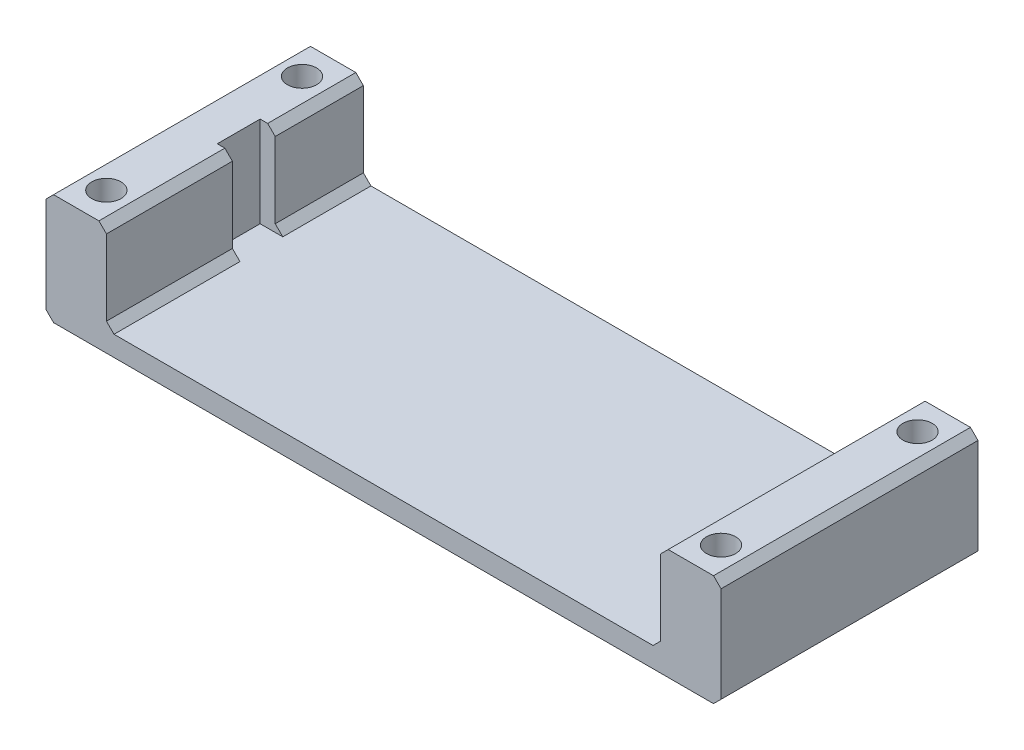
ISO-10303-21;
HEADER;
FILE_DESCRIPTION(('STEP AP214'),'2;1');
FILE_NAME('part.step','',(''),(''),'','','');
FILE_SCHEMA(('AUTOMOTIVE_DESIGN { 1 0 10303 214 1 1 1 1 }'));
ENDSEC;
DATA;
#1=APPLICATION_CONTEXT('core data for automotive mechanical design processes');
#2=APPLICATION_PROTOCOL_DEFINITION('international standard','automotive_design',2000,#1);
#3=PRODUCT_CONTEXT('',#1,'mechanical');
#4=PRODUCT('Part','Part','',(#3));
#5=PRODUCT_RELATED_PRODUCT_CATEGORY('part','',(#4));
#6=PRODUCT_DEFINITION_FORMATION('','',#4);
#7=PRODUCT_DEFINITION_CONTEXT('part definition',#1,'design');
#8=PRODUCT_DEFINITION('design','',#6,#7);
#9=PRODUCT_DEFINITION_SHAPE('','',#8);
#10=(LENGTH_UNIT() NAMED_UNIT(*) SI_UNIT(.MILLI.,.METRE.));
#11=(NAMED_UNIT(*) PLANE_ANGLE_UNIT() SI_UNIT($,.RADIAN.));
#12=(NAMED_UNIT(*) SI_UNIT($,.STERADIAN.) SOLID_ANGLE_UNIT());
#13=UNCERTAINTY_MEASURE_WITH_UNIT(LENGTH_MEASURE(1.E-05),#10,'distance_accuracy_value','');
#14=(GEOMETRIC_REPRESENTATION_CONTEXT(3) GLOBAL_UNCERTAINTY_ASSIGNED_CONTEXT((#13)) GLOBAL_UNIT_ASSIGNED_CONTEXT((#10,
#11,#12)) REPRESENTATION_CONTEXT('',''));
#15=CARTESIAN_POINT('',(0.,0.,0.));
#16=DIRECTION('',(0.,0.,1.));
#17=DIRECTION('',(1.,0.,0.));
#18=AXIS2_PLACEMENT_3D('',#15,#16,#17);
#19=CARTESIAN_POINT('',(0.,2.,0.));
#20=DIRECTION('',(0.,-1.,0.));
#21=DIRECTION('',(0.,0.,-1.));
#22=AXIS2_PLACEMENT_3D('',#19,#20,#21);
#23=PLANE('',#22);
#24=DIRECTION('',(-1.,0.,0.));
#25=VECTOR('',#24,1.);
#26=CARTESIAN_POINT('',(0.,2.,-25.5));
#27=LINE('',#26,#25);
#28=CARTESIAN_POINT('',(60.25,2.,-25.5));
#29=VERTEX_POINT('',#28);
#30=CARTESIAN_POINT('',(6.74999999999999,2.,-25.5));
#31=VERTEX_POINT('',#30);
#32=EDGE_CURVE('E284',#29,#31,#27,.T.);
#33=ORIENTED_EDGE('',*,*,#32,.T.);
#34=DIRECTION('',(0.,0.,1.));
#35=VECTOR('',#34,1.);
#36=CARTESIAN_POINT('',(6.74999999999999,2.,-16.75));
#37=LINE('',#36,#35);
#38=CARTESIAN_POINT('',(6.74999999999999,2.,-16.75));
#39=VERTEX_POINT('',#38);
#40=EDGE_CURVE('E324',#31,#39,#37,.T.);
#41=ORIENTED_EDGE('',*,*,#40,.T.);
#42=DIRECTION('',(1.,0.,0.));
#43=VECTOR('',#42,1.);
#44=CARTESIAN_POINT('',(6.,2.,-16.75));
#45=LINE('',#44,#43);
#46=CARTESIAN_POINT('',(4.5,2.,-16.75));
#47=VERTEX_POINT('',#46);
#48=EDGE_CURVE('E243',#47,#39,#45,.T.);
#49=ORIENTED_EDGE('',*,*,#48,.F.);
#50=DIRECTION('',(0.,0.,-1.));
#51=VECTOR('',#50,1.);
#52=CARTESIAN_POINT('',(4.5,2.,-16.75));
#53=LINE('',#52,#51);
#54=CARTESIAN_POINT('',(4.5,2.,-12.5));
#55=VERTEX_POINT('',#54);
#56=EDGE_CURVE('E237',#55,#47,#53,.T.);
#57=ORIENTED_EDGE('',*,*,#56,.F.);
#58=DIRECTION('',(-1.,0.,0.));
#59=VECTOR('',#58,1.);
#60=CARTESIAN_POINT('',(6.,2.,-12.5));
#61=LINE('',#60,#59);
#62=CARTESIAN_POINT('',(6.74999999999999,2.,-12.5));
#63=VERTEX_POINT('',#62);
#64=EDGE_CURVE('E220',#63,#55,#61,.T.);
#65=ORIENTED_EDGE('',*,*,#64,.F.);
#66=DIRECTION('',(0.,0.,1.));
#67=VECTOR('',#66,1.);
#68=CARTESIAN_POINT('',(6.74999999999999,2.,0.));
#69=LINE('',#68,#67);
#70=CARTESIAN_POINT('',(6.74999999999999,2.,0.));
#71=VERTEX_POINT('',#70);
#72=EDGE_CURVE('E318',#63,#71,#69,.T.);
#73=ORIENTED_EDGE('',*,*,#72,.T.);
#74=DIRECTION('',(1.,0.,0.));
#75=VECTOR('',#74,1.);
#76=CARTESIAN_POINT('',(0.,2.,0.));
#77=LINE('',#76,#75);
#78=CARTESIAN_POINT('',(60.25,2.,0.));
#79=VERTEX_POINT('',#78);
#80=EDGE_CURVE('E276',#71,#79,#77,.T.);
#81=ORIENTED_EDGE('',*,*,#80,.T.);
#82=DIRECTION('',(0.,0.,-1.));
#83=VECTOR('',#82,1.);
#84=CARTESIAN_POINT('',(60.25,2.,-25.5));
#85=LINE('',#84,#83);
#86=EDGE_CURVE('E320',#79,#29,#85,.T.);
#87=ORIENTED_EDGE('',*,*,#86,.T.);
#88=EDGE_LOOP('',(#33,#41,#49,#57,#65,#73,#81,#87));
#89=FACE_BOUND('',#88,.T.);
#90=ADVANCED_FACE('F50',(#89),#23,.F.);
#91=CARTESIAN_POINT('',(0.,2.,0.));
#92=DIRECTION('',(1.,0.,0.));
#93=DIRECTION('',(0.,0.,-1.));
#94=AXIS2_PLACEMENT_3D('',#91,#92,#93);
#95=PLANE('',#94);
#96=DIRECTION('',(0.,-1.,0.));
#97=VECTOR('',#96,1.);
#98=CARTESIAN_POINT('',(0.,2.,0.));
#99=LINE('',#98,#97);
#100=CARTESIAN_POINT('',(0.,10.25,0.));
#101=VERTEX_POINT('',#100);
#102=CARTESIAN_POINT('',(0.,0.749999999999994,0.));
#103=VERTEX_POINT('',#102);
#104=EDGE_CURVE('E306',#101,#103,#99,.T.);
#105=ORIENTED_EDGE('',*,*,#104,.F.);
#106=DIRECTION('',(0.,0.,-1.));
#107=VECTOR('',#106,1.);
#108=CARTESIAN_POINT('',(0.,10.25,0.));
#109=LINE('',#108,#107);
#110=CARTESIAN_POINT('',(0.,10.25,-25.5));
#111=VERTEX_POINT('',#110);
#112=EDGE_CURVE('E407',#101,#111,#109,.T.);
#113=ORIENTED_EDGE('',*,*,#112,.T.);
#114=DIRECTION('',(0.,-1.,0.));
#115=VECTOR('',#114,1.);
#116=CARTESIAN_POINT('',(0.,2.,-25.5));
#117=LINE('',#116,#115);
#118=CARTESIAN_POINT('',(0.,0.749999999999994,-25.5));
#119=VERTEX_POINT('',#118);
#120=EDGE_CURVE('E289',#111,#119,#117,.T.);
#121=ORIENTED_EDGE('',*,*,#120,.T.);
#122=DIRECTION('',(0.,0.,1.));
#123=VECTOR('',#122,1.);
#124=CARTESIAN_POINT('',(0.,0.749999999999994,0.));
#125=LINE('',#124,#123);
#126=EDGE_CURVE('E405',#119,#103,#125,.T.);
#127=ORIENTED_EDGE('',*,*,#126,.T.);
#128=EDGE_LOOP('',(#105,#113,#121,#127));
#129=FACE_BOUND('',#128,.T.);
#130=ADVANCED_FACE('F483',(#129),#95,.F.);
#131=CARTESIAN_POINT('',(0.,2.,0.));
#132=DIRECTION('',(0.,0.,-1.));
#133=DIRECTION('',(-1.,0.,0.));
#134=AXIS2_PLACEMENT_3D('',#131,#132,#133);
#135=PLANE('',#134);
#136=DIRECTION('',(0.,-1.,0.));
#137=VECTOR('',#136,1.);
#138=CARTESIAN_POINT('',(67.,2.,0.));
#139=LINE('',#138,#137);
#140=CARTESIAN_POINT('',(67.,10.25,0.));
#141=VERTEX_POINT('',#140);
#142=CARTESIAN_POINT('',(67.,0.749999999999994,0.));
#143=VERTEX_POINT('',#142);
#144=EDGE_CURVE('E305',#141,#143,#139,.T.);
#145=ORIENTED_EDGE('',*,*,#144,.F.);
#146=DIRECTION('',(0.707106781186551,-0.707106781186544,0.));
#147=VECTOR('',#146,1.);
#148=CARTESIAN_POINT('',(66.25,11.,0.));
#149=LINE('',#148,#147);
#150=CARTESIAN_POINT('',(66.25,11.,0.));
#151=VERTEX_POINT('',#150);
#152=EDGE_CURVE('E386',#141,#151,#149,.F.);
#153=ORIENTED_EDGE('',*,*,#152,.T.);
#154=DIRECTION('',(1.,0.,0.));
#155=VECTOR('',#154,1.);
#156=CARTESIAN_POINT('',(67.,11.,0.));
#157=LINE('',#156,#155);
#158=CARTESIAN_POINT('',(61.75,11.,0.));
#159=VERTEX_POINT('',#158);
#160=EDGE_CURVE('E266',#159,#151,#157,.T.);
#161=ORIENTED_EDGE('',*,*,#160,.F.);
#162=DIRECTION('',(0.707106781186554,0.707106781186541,0.));
#163=VECTOR('',#162,1.);
#164=CARTESIAN_POINT('',(61.75,11.,0.));
#165=LINE('',#164,#163);
#166=CARTESIAN_POINT('',(61.,10.25,0.));
#167=VERTEX_POINT('',#166);
#168=EDGE_CURVE('E372',#159,#167,#165,.F.);
#169=ORIENTED_EDGE('',*,*,#168,.T.);
#170=DIRECTION('',(0.,-1.,0.));
#171=VECTOR('',#170,1.);
#172=CARTESIAN_POINT('',(61.,11.,0.));
#173=LINE('',#172,#171);
#174=CARTESIAN_POINT('',(61.,2.74999999999999,0.));
#175=VERTEX_POINT('',#174);
#176=EDGE_CURVE('E270',#167,#175,#173,.T.);
#177=ORIENTED_EDGE('',*,*,#176,.T.);
#178=DIRECTION('',(0.707106781186541,0.707106781186554,0.));
#179=VECTOR('',#178,1.);
#180=CARTESIAN_POINT('',(30.1250000000006,-28.125,0.));
#181=LINE('',#180,#179);
#182=EDGE_CURVE('E60',#175,#79,#181,.F.);
#183=ORIENTED_EDGE('',*,*,#182,.T.);
#184=ORIENTED_EDGE('',*,*,#80,.F.);
#185=DIRECTION('',(0.707106781186544,-0.707106781186551,0.));
#186=VECTOR('',#185,1.);
#187=CARTESIAN_POINT('',(3.37500000000003,5.375,0.));
#188=LINE('',#187,#186);
#189=CARTESIAN_POINT('',(6.,2.75,0.));
#190=VERTEX_POINT('',#189);
#191=EDGE_CURVE('E426',#71,#190,#188,.F.);
#192=ORIENTED_EDGE('',*,*,#191,.T.);
#193=DIRECTION('',(0.,-1.,0.));
#194=VECTOR('',#193,1.);
#195=CARTESIAN_POINT('',(6.,11.,0.));
#196=LINE('',#195,#194);
#197=CARTESIAN_POINT('',(6.,10.25,0.));
#198=VERTEX_POINT('',#197);
#199=EDGE_CURVE('E259',#198,#190,#196,.T.);
#200=ORIENTED_EDGE('',*,*,#199,.F.);
#201=DIRECTION('',(0.707106781186548,-0.707106781186548,0.));
#202=VECTOR('',#201,1.);
#203=CARTESIAN_POINT('',(5.24999999999999,11.,0.));
#204=LINE('',#203,#202);
#205=CARTESIAN_POINT('',(5.24999999999999,11.,0.));
#206=VERTEX_POINT('',#205);
#207=EDGE_CURVE('E380',#198,#206,#204,.F.);
#208=ORIENTED_EDGE('',*,*,#207,.T.);
#209=DIRECTION('',(1.,0.,0.));
#210=VECTOR('',#209,1.);
#211=CARTESIAN_POINT('',(0.,11.,0.));
#212=LINE('',#211,#210);
#213=CARTESIAN_POINT('',(0.749999999999994,11.,0.));
#214=VERTEX_POINT('',#213);
#215=EDGE_CURVE('E208',#214,#206,#212,.T.);
#216=ORIENTED_EDGE('',*,*,#215,.F.);
#217=DIRECTION('',(0.707106781186544,0.707106781186551,0.));
#218=VECTOR('',#217,1.);
#219=CARTESIAN_POINT('',(0.749999999999994,11.,0.));
#220=LINE('',#219,#218);
#221=EDGE_CURVE('E387',#214,#101,#220,.F.);
#222=ORIENTED_EDGE('',*,*,#221,.T.);
#223=ORIENTED_EDGE('',*,*,#104,.T.);
#224=DIRECTION('',(0.707106781186551,-0.707106781186544,0.));
#225=VECTOR('',#224,1.);
#226=CARTESIAN_POINT('',(0.,0.749999999999994,0.));
#227=LINE('',#226,#225);
#228=CARTESIAN_POINT('',(0.750000000000001,0.,0.));
#229=VERTEX_POINT('',#228);
#230=EDGE_CURVE('E384',#103,#229,#227,.T.);
#231=ORIENTED_EDGE('',*,*,#230,.T.);
#232=DIRECTION('',(1.,0.,0.));
#233=VECTOR('',#232,1.);
#234=CARTESIAN_POINT('',(0.,0.,0.));
#235=LINE('',#234,#233);
#236=CARTESIAN_POINT('',(66.25,0.,0.));
#237=VERTEX_POINT('',#236);
#238=EDGE_CURVE('E279',#229,#237,#235,.T.);
#239=ORIENTED_EDGE('',*,*,#238,.T.);
#240=DIRECTION('',(0.707106781186551,0.707106781186544,0.));
#241=VECTOR('',#240,1.);
#242=CARTESIAN_POINT('',(67.,0.749999999999994,0.));
#243=LINE('',#242,#241);
#244=EDGE_CURVE('E379',#237,#143,#243,.T.);
#245=ORIENTED_EDGE('',*,*,#244,.T.);
#246=EDGE_LOOP('',(#145,#153,#161,#169,#177,#183,#184,#192,#200,#208,#216,#222,#223,#231,#239,#245));
#247=FACE_BOUND('',#246,.T.);
#248=ADVANCED_FACE('F432',(#247),#135,.F.);
#249=CARTESIAN_POINT('',(67.,2.,0.));
#250=DIRECTION('',(-1.,0.,0.));
#251=DIRECTION('',(0.,0.,1.));
#252=AXIS2_PLACEMENT_3D('',#249,#250,#251);
#253=PLANE('',#252);
#254=DIRECTION('',(0.,-1.,0.));
#255=VECTOR('',#254,1.);
#256=CARTESIAN_POINT('',(67.,2.,-25.5));
#257=LINE('',#256,#255);
#258=CARTESIAN_POINT('',(67.,10.25,-25.5));
#259=VERTEX_POINT('',#258);
#260=CARTESIAN_POINT('',(67.,0.749999999999994,-25.5));
#261=VERTEX_POINT('',#260);
#262=EDGE_CURVE('E296',#259,#261,#257,.T.);
#263=ORIENTED_EDGE('',*,*,#262,.F.);
#264=DIRECTION('',(0.,0.,1.));
#265=VECTOR('',#264,1.);
#266=CARTESIAN_POINT('',(67.,10.25,0.));
#267=LINE('',#266,#265);
#268=EDGE_CURVE('E371',#259,#141,#267,.T.);
#269=ORIENTED_EDGE('',*,*,#268,.T.);
#270=ORIENTED_EDGE('',*,*,#144,.T.);
#271=DIRECTION('',(0.,0.,-1.));
#272=VECTOR('',#271,1.);
#273=CARTESIAN_POINT('',(67.,0.749999999999994,-25.5));
#274=LINE('',#273,#272);
#275=EDGE_CURVE('E370',#143,#261,#274,.T.);
#276=ORIENTED_EDGE('',*,*,#275,.T.);
#277=EDGE_LOOP('',(#263,#269,#270,#276));
#278=FACE_BOUND('',#277,.T.);
#279=ADVANCED_FACE('F465',(#278),#253,.F.);
#280=CARTESIAN_POINT('',(0.,2.,-25.5));
#281=DIRECTION('',(0.,0.,1.));
#282=DIRECTION('',(1.,0.,0.));
#283=AXIS2_PLACEMENT_3D('',#280,#281,#282);
#284=PLANE('',#283);
#285=DIRECTION('',(-1.,0.,0.));
#286=VECTOR('',#285,1.);
#287=CARTESIAN_POINT('',(67.,11.,-25.5));
#288=LINE('',#287,#286);
#289=CARTESIAN_POINT('',(66.25,11.,-25.5));
#290=VERTEX_POINT('',#289);
#291=CARTESIAN_POINT('',(61.75,11.,-25.5));
#292=VERTEX_POINT('',#291);
#293=EDGE_CURVE('E265',#290,#292,#288,.T.);
#294=ORIENTED_EDGE('',*,*,#293,.F.);
#295=DIRECTION('',(-0.707106781186551,0.707106781186544,0.));
#296=VECTOR('',#295,1.);
#297=CARTESIAN_POINT('',(66.25,11.,-25.5));
#298=LINE('',#297,#296);
#299=EDGE_CURVE('E364',#290,#259,#298,.F.);
#300=ORIENTED_EDGE('',*,*,#299,.T.);
#301=ORIENTED_EDGE('',*,*,#262,.T.);
#302=DIRECTION('',(-0.707106781186551,-0.707106781186544,0.));
#303=VECTOR('',#302,1.);
#304=CARTESIAN_POINT('',(67.,0.749999999999994,-25.5));
#305=LINE('',#304,#303);
#306=CARTESIAN_POINT('',(66.25,0.,-25.5));
#307=VERTEX_POINT('',#306);
#308=EDGE_CURVE('E355',#261,#307,#305,.T.);
#309=ORIENTED_EDGE('',*,*,#308,.T.);
#310=DIRECTION('',(-1.,0.,0.));
#311=VECTOR('',#310,1.);
#312=CARTESIAN_POINT('',(0.,0.,-25.5));
#313=LINE('',#312,#311);
#314=CARTESIAN_POINT('',(0.750000000000001,0.,-25.5));
#315=VERTEX_POINT('',#314);
#316=EDGE_CURVE('E281',#307,#315,#313,.T.);
#317=ORIENTED_EDGE('',*,*,#316,.T.);
#318=DIRECTION('',(-0.707106781186551,0.707106781186544,0.));
#319=VECTOR('',#318,1.);
#320=CARTESIAN_POINT('',(0.,0.749999999999994,-25.5));
#321=LINE('',#320,#319);
#322=EDGE_CURVE('E356',#315,#119,#321,.T.);
#323=ORIENTED_EDGE('',*,*,#322,.T.);
#324=ORIENTED_EDGE('',*,*,#120,.F.);
#325=DIRECTION('',(-0.707106781186544,-0.707106781186551,0.));
#326=VECTOR('',#325,1.);
#327=CARTESIAN_POINT('',(0.749999999999994,11.,-25.5));
#328=LINE('',#327,#326);
#329=CARTESIAN_POINT('',(0.749999999999994,11.,-25.5));
#330=VERTEX_POINT('',#329);
#331=EDGE_CURVE('E363',#111,#330,#328,.F.);
#332=ORIENTED_EDGE('',*,*,#331,.T.);
#333=DIRECTION('',(-1.,0.,0.));
#334=VECTOR('',#333,1.);
#335=CARTESIAN_POINT('',(0.,11.,-25.5));
#336=LINE('',#335,#334);
#337=CARTESIAN_POINT('',(5.24999999999999,11.,-25.5));
#338=VERTEX_POINT('',#337);
#339=EDGE_CURVE('E229',#338,#330,#336,.T.);
#340=ORIENTED_EDGE('',*,*,#339,.F.);
#341=DIRECTION('',(-0.707106781186547,0.707106781186548,0.));
#342=VECTOR('',#341,1.);
#343=CARTESIAN_POINT('',(5.24999999999999,11.,-25.5));
#344=LINE('',#343,#342);
#345=CARTESIAN_POINT('',(6.,10.25,-25.5));
#346=VERTEX_POINT('',#345);
#347=EDGE_CURVE('E352',#338,#346,#344,.F.);
#348=ORIENTED_EDGE('',*,*,#347,.T.);
#349=DIRECTION('',(0.,-1.,0.));
#350=VECTOR('',#349,1.);
#351=CARTESIAN_POINT('',(6.,11.,-25.5));
#352=LINE('',#351,#350);
#353=CARTESIAN_POINT('',(6.,2.75,-25.5));
#354=VERTEX_POINT('',#353);
#355=EDGE_CURVE('E236',#346,#354,#352,.T.);
#356=ORIENTED_EDGE('',*,*,#355,.T.);
#357=DIRECTION('',(-0.707106781186544,0.707106781186551,0.));
#358=VECTOR('',#357,1.);
#359=CARTESIAN_POINT('',(3.37500000000003,5.375,-25.5));
#360=LINE('',#359,#358);
#361=EDGE_CURVE('E418',#354,#31,#360,.F.);
#362=ORIENTED_EDGE('',*,*,#361,.T.);
#363=ORIENTED_EDGE('',*,*,#32,.F.);
#364=DIRECTION('',(-0.707106781186541,-0.707106781186554,0.));
#365=VECTOR('',#364,1.);
#366=CARTESIAN_POINT('',(30.1250000000006,-28.125,-25.5));
#367=LINE('',#366,#365);
#368=CARTESIAN_POINT('',(61.,2.74999999999999,-25.5));
#369=VERTEX_POINT('',#368);
#370=EDGE_CURVE('E11',#29,#369,#367,.F.);
#371=ORIENTED_EDGE('',*,*,#370,.T.);
#372=DIRECTION('',(0.,-1.,0.));
#373=VECTOR('',#372,1.);
#374=CARTESIAN_POINT('',(61.,11.,-25.5));
#375=LINE('',#374,#373);
#376=CARTESIAN_POINT('',(61.,10.25,-25.5));
#377=VERTEX_POINT('',#376);
#378=EDGE_CURVE('E274',#377,#369,#375,.T.);
#379=ORIENTED_EDGE('',*,*,#378,.F.);
#380=DIRECTION('',(-0.707106781186554,-0.707106781186541,0.));
#381=VECTOR('',#380,1.);
#382=CARTESIAN_POINT('',(61.75,11.,-25.5));
#383=LINE('',#382,#381);
#384=EDGE_CURVE('E346',#377,#292,#383,.F.);
#385=ORIENTED_EDGE('',*,*,#384,.T.);
#386=EDGE_LOOP('',(#294,#300,#301,#309,#317,#323,#324,#332,#340,#348,#356,#362,#363,#371,#379,#385));
#387=FACE_BOUND('',#386,.T.);
#388=ADVANCED_FACE('F449',(#387),#284,.F.);
#389=CARTESIAN_POINT('',(0.,0.,0.));
#390=DIRECTION('',(0.,-1.,0.));
#391=DIRECTION('',(0.,0.,-1.));
#392=AXIS2_PLACEMENT_3D('',#389,#390,#391);
#393=PLANE('',#392);
#394=ORIENTED_EDGE('',*,*,#238,.F.);
#395=DIRECTION('',(0.,0.,-1.));
#396=VECTOR('',#395,1.);
#397=CARTESIAN_POINT('',(0.750000000000001,0.,-25.5));
#398=LINE('',#397,#396);
#399=EDGE_CURVE('E415',#229,#315,#398,.T.);
#400=ORIENTED_EDGE('',*,*,#399,.T.);
#401=ORIENTED_EDGE('',*,*,#316,.F.);
#402=DIRECTION('',(0.,0.,1.));
#403=VECTOR('',#402,1.);
#404=CARTESIAN_POINT('',(66.25,0.,0.));
#405=LINE('',#404,#403);
#406=EDGE_CURVE('E406',#307,#237,#405,.T.);
#407=ORIENTED_EDGE('',*,*,#406,.T.);
#408=EDGE_LOOP('',(#394,#400,#401,#407));
#409=FACE_BOUND('',#408,.T.);
#410=ADVANCED_FACE('F473',(#409),#393,.T.);
#411=CARTESIAN_POINT('',(61.,11.,-25.5));
#412=DIRECTION('',(1.,0.,0.));
#413=DIRECTION('',(0.,0.,-1.));
#414=AXIS2_PLACEMENT_3D('',#411,#412,#413);
#415=PLANE('',#414);
#416=ORIENTED_EDGE('',*,*,#378,.T.);
#417=DIRECTION('',(0.,0.,1.));
#418=VECTOR('',#417,1.);
#419=CARTESIAN_POINT('',(61.,2.74999999999999,0.));
#420=LINE('',#419,#418);
#421=EDGE_CURVE('E340',#369,#175,#420,.T.);
#422=ORIENTED_EDGE('',*,*,#421,.T.);
#423=ORIENTED_EDGE('',*,*,#176,.F.);
#424=DIRECTION('',(0.,0.,-1.));
#425=VECTOR('',#424,1.);
#426=CARTESIAN_POINT('',(61.,10.25,-25.5));
#427=LINE('',#426,#425);
#428=EDGE_CURVE('E333',#167,#377,#427,.T.);
#429=ORIENTED_EDGE('',*,*,#428,.T.);
#430=EDGE_LOOP('',(#416,#422,#423,#429));
#431=FACE_BOUND('',#430,.T.);
#432=ADVANCED_FACE('F452',(#431),#415,.F.);
#433=CARTESIAN_POINT('',(0.,11.,0.));
#434=DIRECTION('',(0.,-1.,0.));
#435=DIRECTION('',(0.,0.,-1.));
#436=AXIS2_PLACEMENT_3D('',#433,#434,#435);
#437=PLANE('',#436);
#438=CARTESIAN_POINT('',(64.,11.,-22.5));
#439=DIRECTION('',(0.,1.,0.));
#440=DIRECTION('',(0.,0.,1.));
#441=AXIS2_PLACEMENT_3D('',#438,#439,#440);
#442=CIRCLE('',#441,1.45);
#443=CARTESIAN_POINT('',(64.,11.,-21.05));
#444=VERTEX_POINT('',#443);
#445=EDGE_CURVE('E596',#444,#444,#442,.T.);
#446=ORIENTED_EDGE('',*,*,#445,.F.);
#447=EDGE_LOOP('',(#446));
#448=FACE_BOUND('',#447,.T.);
#449=CARTESIAN_POINT('',(64.,11.,-3.));
#450=DIRECTION('',(0.,1.,0.));
#451=DIRECTION('',(0.,0.,1.));
#452=AXIS2_PLACEMENT_3D('',#449,#450,#451);
#453=CIRCLE('',#452,1.45);
#454=CARTESIAN_POINT('',(64.,11.,-1.55));
#455=VERTEX_POINT('',#454);
#456=EDGE_CURVE('E599',#455,#455,#453,.T.);
#457=ORIENTED_EDGE('',*,*,#456,.F.);
#458=EDGE_LOOP('',(#457));
#459=FACE_BOUND('',#458,.T.);
#460=ORIENTED_EDGE('',*,*,#160,.T.);
#461=DIRECTION('',(0.,0.,-1.));
#462=VECTOR('',#461,1.);
#463=CARTESIAN_POINT('',(66.25,11.,0.));
#464=LINE('',#463,#462);
#465=EDGE_CURVE('E343',#151,#290,#464,.T.);
#466=ORIENTED_EDGE('',*,*,#465,.T.);
#467=ORIENTED_EDGE('',*,*,#293,.T.);
#468=DIRECTION('',(0.,0.,1.));
#469=VECTOR('',#468,1.);
#470=CARTESIAN_POINT('',(61.75,11.,0.));
#471=LINE('',#470,#469);
#472=EDGE_CURVE('E342',#292,#159,#471,.T.);
#473=ORIENTED_EDGE('',*,*,#472,.T.);
#474=EDGE_LOOP('',(#460,#466,#467,#473));
#475=FACE_BOUND('',#474,.T.);
#476=ADVANCED_FACE('F457',(#448,#459,#475),#437,.F.);
#477=CARTESIAN_POINT('',(6.,11.,0.));
#478=DIRECTION('',(-1.,0.,0.));
#479=DIRECTION('',(0.,0.,1.));
#480=AXIS2_PLACEMENT_3D('',#477,#478,#479);
#481=PLANE('',#480);
#482=ORIENTED_EDGE('',*,*,#199,.T.);
#483=DIRECTION('',(0.,0.,-1.));
#484=VECTOR('',#483,1.);
#485=CARTESIAN_POINT('',(6.,2.75,-12.5));
#486=LINE('',#485,#484);
#487=CARTESIAN_POINT('',(6.,2.75,-12.5));
#488=VERTEX_POINT('',#487);
#489=EDGE_CURVE('E328',#190,#488,#486,.T.);
#490=ORIENTED_EDGE('',*,*,#489,.T.);
#491=DIRECTION('',(0.,-1.,0.));
#492=VECTOR('',#491,1.);
#493=CARTESIAN_POINT('',(6.,11.,-12.5));
#494=LINE('',#493,#492);
#495=CARTESIAN_POINT('',(6.,10.25,-12.5));
#496=VERTEX_POINT('',#495);
#497=EDGE_CURVE('E221',#496,#488,#494,.T.);
#498=ORIENTED_EDGE('',*,*,#497,.F.);
#499=DIRECTION('',(0.,0.,1.));
#500=VECTOR('',#499,1.);
#501=CARTESIAN_POINT('',(6.,10.25,0.));
#502=LINE('',#501,#500);
#503=EDGE_CURVE('E330',#496,#198,#502,.T.);
#504=ORIENTED_EDGE('',*,*,#503,.T.);
#505=EDGE_LOOP('',(#482,#490,#498,#504));
#506=FACE_BOUND('',#505,.T.);
#507=ADVANCED_FACE('F883',(#506),#481,.F.);
#508=CARTESIAN_POINT('',(6.,11.,-12.5));
#509=DIRECTION('',(0.,0.,1.));
#510=DIRECTION('',(1.,0.,0.));
#511=AXIS2_PLACEMENT_3D('',#508,#509,#510);
#512=PLANE('',#511);
#513=DIRECTION('',(-1.,0.,0.));
#514=VECTOR('',#513,1.);
#515=CARTESIAN_POINT('',(6.,11.,-12.5));
#516=LINE('',#515,#514);
#517=CARTESIAN_POINT('',(5.24999999999999,11.,-12.5));
#518=VERTEX_POINT('',#517);
#519=CARTESIAN_POINT('',(4.5,11.,-12.5));
#520=VERTEX_POINT('',#519);
#521=EDGE_CURVE('E196',#518,#520,#516,.T.);
#522=ORIENTED_EDGE('',*,*,#521,.F.);
#523=DIRECTION('',(-0.707106781186548,0.707106781186548,0.));
#524=VECTOR('',#523,1.);
#525=CARTESIAN_POINT('',(5.25,11.,-12.5));
#526=LINE('',#525,#524);
#527=EDGE_CURVE('E72',#518,#496,#526,.F.);
#528=ORIENTED_EDGE('',*,*,#527,.T.);
#529=ORIENTED_EDGE('',*,*,#497,.T.);
#530=DIRECTION('',(-0.707106781186544,0.707106781186551,0.));
#531=VECTOR('',#530,1.);
#532=CARTESIAN_POINT('',(1.875,6.87500000000004,-12.5));
#533=LINE('',#532,#531);
#534=EDGE_CURVE('E424',#488,#63,#533,.F.);
#535=ORIENTED_EDGE('',*,*,#534,.T.);
#536=ORIENTED_EDGE('',*,*,#64,.T.);
#537=DIRECTION('',(0.,-1.,0.));
#538=VECTOR('',#537,1.);
#539=CARTESIAN_POINT('',(4.5,11.,-12.5));
#540=LINE('',#539,#538);
#541=EDGE_CURVE('E211',#520,#55,#540,.T.);
#542=ORIENTED_EDGE('',*,*,#541,.F.);
#543=EDGE_LOOP('',(#522,#528,#529,#535,#536,#542));
#544=FACE_BOUND('',#543,.T.);
#545=ADVANCED_FACE('F213',(#544),#512,.F.);
#546=CARTESIAN_POINT('',(4.5,11.,-16.75));
#547=DIRECTION('',(-1.,0.,0.));
#548=DIRECTION('',(0.,0.,1.));
#549=AXIS2_PLACEMENT_3D('',#546,#547,#548);
#550=PLANE('',#549);
#551=ORIENTED_EDGE('',*,*,#56,.T.);
#552=DIRECTION('',(0.,-1.,0.));
#553=VECTOR('',#552,1.);
#554=CARTESIAN_POINT('',(4.5,11.,-16.75));
#555=LINE('',#554,#553);
#556=CARTESIAN_POINT('',(4.5,11.,-16.75));
#557=VERTEX_POINT('',#556);
#558=EDGE_CURVE('E222',#557,#47,#555,.T.);
#559=ORIENTED_EDGE('',*,*,#558,.F.);
#560=DIRECTION('',(0.,0.,-1.));
#561=VECTOR('',#560,1.);
#562=CARTESIAN_POINT('',(4.5,11.,-16.75));
#563=LINE('',#562,#561);
#564=EDGE_CURVE('E203',#520,#557,#563,.T.);
#565=ORIENTED_EDGE('',*,*,#564,.F.);
#566=ORIENTED_EDGE('',*,*,#541,.T.);
#567=EDGE_LOOP('',(#551,#559,#565,#566));
#568=FACE_BOUND('',#567,.T.);
#569=ADVANCED_FACE('F223',(#568),#550,.F.);
#570=CARTESIAN_POINT('',(6.,11.,-16.75));
#571=DIRECTION('',(0.,0.,-1.));
#572=DIRECTION('',(-1.,0.,0.));
#573=AXIS2_PLACEMENT_3D('',#570,#571,#572);
#574=PLANE('',#573);
#575=DIRECTION('',(0.,-1.,0.));
#576=VECTOR('',#575,1.);
#577=CARTESIAN_POINT('',(6.,11.,-16.75));
#578=LINE('',#577,#576);
#579=CARTESIAN_POINT('',(6.,10.25,-16.75));
#580=VERTEX_POINT('',#579);
#581=CARTESIAN_POINT('',(6.,2.75,-16.75));
#582=VERTEX_POINT('',#581);
#583=EDGE_CURVE('E248',#580,#582,#578,.T.);
#584=ORIENTED_EDGE('',*,*,#583,.F.);
#585=DIRECTION('',(0.707106781186547,-0.707106781186548,0.));
#586=VECTOR('',#585,1.);
#587=CARTESIAN_POINT('',(5.24999999999999,11.,-16.75));
#588=LINE('',#587,#586);
#589=CARTESIAN_POINT('',(5.24999999999999,11.,-16.75));
#590=VERTEX_POINT('',#589);
#591=EDGE_CURVE('E61',#580,#590,#588,.F.);
#592=ORIENTED_EDGE('',*,*,#591,.T.);
#593=DIRECTION('',(1.,0.,0.));
#594=VECTOR('',#593,1.);
#595=CARTESIAN_POINT('',(6.,11.,-16.75));
#596=LINE('',#595,#594);
#597=EDGE_CURVE('E227',#557,#590,#596,.T.);
#598=ORIENTED_EDGE('',*,*,#597,.F.);
#599=ORIENTED_EDGE('',*,*,#558,.T.);
#600=ORIENTED_EDGE('',*,*,#48,.T.);
#601=DIRECTION('',(0.707106781186544,-0.707106781186551,0.));
#602=VECTOR('',#601,1.);
#603=CARTESIAN_POINT('',(1.875,6.87500000000004,-16.75));
#604=LINE('',#603,#602);
#605=EDGE_CURVE('E422',#39,#582,#604,.F.);
#606=ORIENTED_EDGE('',*,*,#605,.T.);
#607=EDGE_LOOP('',(#584,#592,#598,#599,#600,#606));
#608=FACE_BOUND('',#607,.T.);
#609=ADVANCED_FACE('F503',(#608),#574,.F.);
#610=CARTESIAN_POINT('',(6.,11.,-16.75));
#611=DIRECTION('',(-1.,0.,0.));
#612=DIRECTION('',(0.,0.,1.));
#613=AXIS2_PLACEMENT_3D('',#610,#611,#612);
#614=PLANE('',#613);
#615=ORIENTED_EDGE('',*,*,#583,.T.);
#616=DIRECTION('',(0.,0.,-1.));
#617=VECTOR('',#616,1.);
#618=CARTESIAN_POINT('',(6.,2.75,-25.5));
#619=LINE('',#618,#617);
#620=EDGE_CURVE('E312',#582,#354,#619,.T.);
#621=ORIENTED_EDGE('',*,*,#620,.T.);
#622=ORIENTED_EDGE('',*,*,#355,.F.);
#623=DIRECTION('',(0.,0.,1.));
#624=VECTOR('',#623,1.);
#625=CARTESIAN_POINT('',(6.,10.25,-16.75));
#626=LINE('',#625,#624);
#627=EDGE_CURVE('E309',#346,#580,#626,.T.);
#628=ORIENTED_EDGE('',*,*,#627,.T.);
#629=EDGE_LOOP('',(#615,#621,#622,#628));
#630=FACE_BOUND('',#629,.T.);
#631=ADVANCED_FACE('F500',(#630),#614,.F.);
#632=CARTESIAN_POINT('',(0.,11.,0.));
#633=DIRECTION('',(0.,-1.,0.));
#634=DIRECTION('',(0.,0.,-1.));
#635=AXIS2_PLACEMENT_3D('',#632,#633,#634);
#636=PLANE('',#635);
#637=CARTESIAN_POINT('',(2.98819509348534,11.,-3.));
#638=DIRECTION('',(0.,1.,0.));
#639=DIRECTION('',(0.,0.,1.));
#640=AXIS2_PLACEMENT_3D('',#637,#638,#639);
#641=CIRCLE('',#640,1.45);
#642=CARTESIAN_POINT('',(2.98819509348534,11.,-1.55));
#643=VERTEX_POINT('',#642);
#644=EDGE_CURVE('E588',#643,#643,#641,.T.);
#645=ORIENTED_EDGE('',*,*,#644,.F.);
#646=EDGE_LOOP('',(#645));
#647=FACE_BOUND('',#646,.T.);
#648=CARTESIAN_POINT('',(2.91146320114002,11.,-22.5));
#649=DIRECTION('',(0.,1.,0.));
#650=DIRECTION('',(0.,0.,1.));
#651=AXIS2_PLACEMENT_3D('',#648,#649,#650);
#652=CIRCLE('',#651,1.45);
#653=CARTESIAN_POINT('',(2.91146320114002,11.,-21.05));
#654=VERTEX_POINT('',#653);
#655=EDGE_CURVE('E587',#654,#654,#652,.T.);
#656=ORIENTED_EDGE('',*,*,#655,.F.);
#657=EDGE_LOOP('',(#656));
#658=FACE_BOUND('',#657,.T.);
#659=ORIENTED_EDGE('',*,*,#339,.T.);
#660=DIRECTION('',(0.,0.,1.));
#661=VECTOR('',#660,1.);
#662=CARTESIAN_POINT('',(0.749999999999994,11.,0.));
#663=LINE('',#662,#661);
#664=EDGE_CURVE('E399',#330,#214,#663,.T.);
#665=ORIENTED_EDGE('',*,*,#664,.T.);
#666=ORIENTED_EDGE('',*,*,#215,.T.);
#667=DIRECTION('',(0.,0.,-1.));
#668=VECTOR('',#667,1.);
#669=CARTESIAN_POINT('',(5.24999999999999,11.,0.));
#670=LINE('',#669,#668);
#671=EDGE_CURVE('E210',#206,#518,#670,.T.);
#672=ORIENTED_EDGE('',*,*,#671,.T.);
#673=ORIENTED_EDGE('',*,*,#521,.T.);
#674=ORIENTED_EDGE('',*,*,#564,.T.);
#675=ORIENTED_EDGE('',*,*,#597,.T.);
#676=DIRECTION('',(0.,0.,-1.));
#677=VECTOR('',#676,1.);
#678=CARTESIAN_POINT('',(5.25,11.,0.));
#679=LINE('',#678,#677);
#680=EDGE_CURVE('E391',#590,#338,#679,.T.);
#681=ORIENTED_EDGE('',*,*,#680,.T.);
#682=EDGE_LOOP('',(#659,#665,#666,#672,#673,#674,#675,#681));
#683=FACE_BOUND('',#682,.T.);
#684=ADVANCED_FACE('F202',(#647,#658,#683),#636,.F.);
#685=CARTESIAN_POINT('',(2.91146320114002,8.,-22.5));
#686=DIRECTION('',(0.,1.,0.));
#687=DIRECTION('',(0.,0.,1.));
#688=AXIS2_PLACEMENT_3D('',#685,#686,#687);
#689=CYLINDRICAL_SURFACE('',#688,1.45);
#690=CARTESIAN_POINT('',(2.91146320114002,8.,-22.5));
#691=DIRECTION('',(0.,1.,0.));
#692=DIRECTION('',(0.,0.,1.));
#693=AXIS2_PLACEMENT_3D('',#690,#691,#692);
#694=CIRCLE('',#693,1.45);
#695=CARTESIAN_POINT('',(2.91146320114002,8.,-21.05));
#696=VERTEX_POINT('',#695);
#697=EDGE_CURVE('E239',#696,#696,#694,.T.);
#698=ORIENTED_EDGE('',*,*,#697,.F.);
#699=EDGE_LOOP('',(#698));
#700=FACE_BOUND('',#699,.T.);
#701=ORIENTED_EDGE('',*,*,#655,.T.);
#702=EDGE_LOOP('',(#701));
#703=FACE_BOUND('',#702,.T.);
#704=ADVANCED_FACE('F669',(#700,#703),#689,.F.);
#705=CARTESIAN_POINT('',(2.91146320114002,8.,-22.5));
#706=DIRECTION('',(0.,1.,0.));
#707=DIRECTION('',(0.,0.,1.));
#708=AXIS2_PLACEMENT_3D('',#705,#706,#707);
#709=PLANE('',#708);
#710=CARTESIAN_POINT('',(2.91146320114002,8.,-22.5));
#711=DIRECTION('',(0.,1.,0.));
#712=DIRECTION('',(0.,0.,1.));
#713=AXIS2_PLACEMENT_3D('',#710,#711,#712);
#714=CIRCLE('',#713,1.05);
#715=CARTESIAN_POINT('',(2.91146320114002,8.,-21.45));
#716=VERTEX_POINT('',#715);
#717=EDGE_CURVE('E616',#716,#716,#714,.T.);
#718=ORIENTED_EDGE('',*,*,#717,.F.);
#719=EDGE_LOOP('',(#718));
#720=FACE_BOUND('',#719,.T.);
#721=ORIENTED_EDGE('',*,*,#697,.T.);
#722=EDGE_LOOP('',(#721));
#723=FACE_BOUND('',#722,.T.);
#724=ADVANCED_FACE('F665',(#720,#723),#709,.T.);
#725=CARTESIAN_POINT('',(2.98819509348534,8.,-3.));
#726=DIRECTION('',(0.,1.,0.));
#727=DIRECTION('',(0.,0.,1.));
#728=AXIS2_PLACEMENT_3D('',#725,#726,#727);
#729=CYLINDRICAL_SURFACE('',#728,1.45);
#730=CARTESIAN_POINT('',(2.98819509348534,8.,-3.));
#731=DIRECTION('',(0.,1.,0.));
#732=DIRECTION('',(0.,0.,1.));
#733=AXIS2_PLACEMENT_3D('',#730,#731,#732);
#734=CIRCLE('',#733,1.45);
#735=CARTESIAN_POINT('',(2.98819509348534,8.,-1.55));
#736=VERTEX_POINT('',#735);
#737=EDGE_CURVE('E604',#736,#736,#734,.T.);
#738=ORIENTED_EDGE('',*,*,#737,.F.);
#739=EDGE_LOOP('',(#738));
#740=FACE_BOUND('',#739,.T.);
#741=ORIENTED_EDGE('',*,*,#644,.T.);
#742=EDGE_LOOP('',(#741));
#743=FACE_BOUND('',#742,.T.);
#744=ADVANCED_FACE('F656',(#740,#743),#729,.F.);
#745=CARTESIAN_POINT('',(2.98819509348534,8.,-3.));
#746=DIRECTION('',(0.,1.,0.));
#747=DIRECTION('',(0.,0.,1.));
#748=AXIS2_PLACEMENT_3D('',#745,#746,#747);
#749=PLANE('',#748);
#750=CARTESIAN_POINT('',(2.98819509348534,8.,-3.));
#751=DIRECTION('',(0.,1.,0.));
#752=DIRECTION('',(0.,0.,1.));
#753=AXIS2_PLACEMENT_3D('',#750,#751,#752);
#754=CIRCLE('',#753,1.05);
#755=CARTESIAN_POINT('',(2.98819509348534,8.,-1.95));
#756=VERTEX_POINT('',#755);
#757=EDGE_CURVE('E625',#756,#756,#754,.T.);
#758=ORIENTED_EDGE('',*,*,#757,.F.);
#759=EDGE_LOOP('',(#758));
#760=FACE_BOUND('',#759,.T.);
#761=ORIENTED_EDGE('',*,*,#737,.T.);
#762=EDGE_LOOP('',(#761));
#763=FACE_BOUND('',#762,.T.);
#764=ADVANCED_FACE('F655',(#760,#763),#749,.T.);
#765=CARTESIAN_POINT('',(64.,8.,-3.));
#766=DIRECTION('',(0.,1.,0.));
#767=DIRECTION('',(0.,0.,1.));
#768=AXIS2_PLACEMENT_3D('',#765,#766,#767);
#769=CYLINDRICAL_SURFACE('',#768,1.45);
#770=CARTESIAN_POINT('',(64.,8.,-3.));
#771=DIRECTION('',(0.,1.,0.));
#772=DIRECTION('',(0.,0.,1.));
#773=AXIS2_PLACEMENT_3D('',#770,#771,#772);
#774=CIRCLE('',#773,1.45);
#775=CARTESIAN_POINT('',(64.,8.,-1.55));
#776=VERTEX_POINT('',#775);
#777=EDGE_CURVE('E608',#776,#776,#774,.T.);
#778=ORIENTED_EDGE('',*,*,#777,.F.);
#779=EDGE_LOOP('',(#778));
#780=FACE_BOUND('',#779,.T.);
#781=ORIENTED_EDGE('',*,*,#456,.T.);
#782=EDGE_LOOP('',(#781));
#783=FACE_BOUND('',#782,.T.);
#784=ADVANCED_FACE('F653',(#780,#783),#769,.F.);
#785=CARTESIAN_POINT('',(64.,8.,-3.));
#786=DIRECTION('',(0.,1.,0.));
#787=DIRECTION('',(0.,0.,1.));
#788=AXIS2_PLACEMENT_3D('',#785,#786,#787);
#789=PLANE('',#788);
#790=CARTESIAN_POINT('',(64.,8.,-3.));
#791=DIRECTION('',(0.,1.,0.));
#792=DIRECTION('',(0.,0.,1.));
#793=AXIS2_PLACEMENT_3D('',#790,#791,#792);
#794=CIRCLE('',#793,1.04999999999999);
#795=CARTESIAN_POINT('',(64.,8.,-1.95));
#796=VERTEX_POINT('',#795);
#797=EDGE_CURVE('E637',#796,#796,#794,.T.);
#798=ORIENTED_EDGE('',*,*,#797,.F.);
#799=EDGE_LOOP('',(#798));
#800=FACE_BOUND('',#799,.T.);
#801=ORIENTED_EDGE('',*,*,#777,.T.);
#802=EDGE_LOOP('',(#801));
#803=FACE_BOUND('',#802,.T.);
#804=ADVANCED_FACE('F688',(#800,#803),#789,.T.);
#805=CARTESIAN_POINT('',(64.,8.,-22.5));
#806=DIRECTION('',(0.,1.,0.));
#807=DIRECTION('',(0.,0.,1.));
#808=AXIS2_PLACEMENT_3D('',#805,#806,#807);
#809=CYLINDRICAL_SURFACE('',#808,1.45);
#810=CARTESIAN_POINT('',(64.,8.,-22.5));
#811=DIRECTION('',(0.,1.,0.));
#812=DIRECTION('',(0.,0.,1.));
#813=AXIS2_PLACEMENT_3D('',#810,#811,#812);
#814=CIRCLE('',#813,1.45);
#815=CARTESIAN_POINT('',(64.,8.,-21.05));
#816=VERTEX_POINT('',#815);
#817=EDGE_CURVE('E593',#816,#816,#814,.T.);
#818=ORIENTED_EDGE('',*,*,#817,.F.);
#819=EDGE_LOOP('',(#818));
#820=FACE_BOUND('',#819,.T.);
#821=ORIENTED_EDGE('',*,*,#445,.T.);
#822=EDGE_LOOP('',(#821));
#823=FACE_BOUND('',#822,.T.);
#824=ADVANCED_FACE('F685',(#820,#823),#809,.F.);
#825=CARTESIAN_POINT('',(64.,8.,-22.5));
#826=DIRECTION('',(0.,1.,0.));
#827=DIRECTION('',(0.,0.,1.));
#828=AXIS2_PLACEMENT_3D('',#825,#826,#827);
#829=PLANE('',#828);
#830=CARTESIAN_POINT('',(64.,8.,-22.5));
#831=DIRECTION('',(0.,1.,0.));
#832=DIRECTION('',(0.,0.,1.));
#833=AXIS2_PLACEMENT_3D('',#830,#831,#832);
#834=CIRCLE('',#833,1.04999999999999);
#835=CARTESIAN_POINT('',(64.,8.,-21.45));
#836=VERTEX_POINT('',#835);
#837=EDGE_CURVE('E629',#836,#836,#834,.T.);
#838=ORIENTED_EDGE('',*,*,#837,.F.);
#839=EDGE_LOOP('',(#838));
#840=FACE_BOUND('',#839,.T.);
#841=ORIENTED_EDGE('',*,*,#817,.T.);
#842=EDGE_LOOP('',(#841));
#843=FACE_BOUND('',#842,.T.);
#844=ADVANCED_FACE('F539',(#840,#843),#829,.T.);
#845=CARTESIAN_POINT('',(6.,2.75,-16.75));
#846=DIRECTION('',(0.707106781186551,0.707106781186544,0.));
#847=DIRECTION('',(0.,0.,1.));
#848=AXIS2_PLACEMENT_3D('',#845,#846,#847);
#849=PLANE('',#848);
#850=ORIENTED_EDGE('',*,*,#605,.F.);
#851=ORIENTED_EDGE('',*,*,#40,.F.);
#852=ORIENTED_EDGE('',*,*,#361,.F.);
#853=ORIENTED_EDGE('',*,*,#620,.F.);
#854=EDGE_LOOP('',(#850,#851,#852,#853));
#855=FACE_BOUND('',#854,.T.);
#856=ADVANCED_FACE('F501',(#855),#849,.T.);
#857=CARTESIAN_POINT('',(6.,2.75,0.));
#858=DIRECTION('',(0.707106781186551,0.707106781186544,0.));
#859=DIRECTION('',(0.,0.,1.));
#860=AXIS2_PLACEMENT_3D('',#857,#858,#859);
#861=PLANE('',#860);
#862=ORIENTED_EDGE('',*,*,#191,.F.);
#863=ORIENTED_EDGE('',*,*,#72,.F.);
#864=ORIENTED_EDGE('',*,*,#534,.F.);
#865=ORIENTED_EDGE('',*,*,#489,.F.);
#866=EDGE_LOOP('',(#862,#863,#864,#865));
#867=FACE_BOUND('',#866,.T.);
#868=ADVANCED_FACE('F540',(#867),#861,.T.);
#869=CARTESIAN_POINT('',(61.,2.74999999999999,-25.5));
#870=DIRECTION('',(-0.707106781186554,0.707106781186541,0.));
#871=DIRECTION('',(0.,0.,-1.));
#872=AXIS2_PLACEMENT_3D('',#869,#870,#871);
#873=PLANE('',#872);
#874=ORIENTED_EDGE('',*,*,#370,.F.);
#875=ORIENTED_EDGE('',*,*,#86,.F.);
#876=ORIENTED_EDGE('',*,*,#182,.F.);
#877=ORIENTED_EDGE('',*,*,#421,.F.);
#878=EDGE_LOOP('',(#874,#875,#876,#877));
#879=FACE_BOUND('',#878,.T.);
#880=ADVANCED_FACE('F443',(#879),#873,.T.);
#881=CARTESIAN_POINT('',(66.25,11.,0.));
#882=DIRECTION('',(-0.707106781186544,-0.707106781186551,0.));
#883=DIRECTION('',(0.,0.,-1.));
#884=AXIS2_PLACEMENT_3D('',#881,#882,#883);
#885=PLANE('',#884);
#886=ORIENTED_EDGE('',*,*,#152,.F.);
#887=ORIENTED_EDGE('',*,*,#268,.F.);
#888=ORIENTED_EDGE('',*,*,#299,.F.);
#889=ORIENTED_EDGE('',*,*,#465,.F.);
#890=EDGE_LOOP('',(#886,#887,#888,#889));
#891=FACE_BOUND('',#890,.T.);
#892=ADVANCED_FACE('F461',(#891),#885,.F.);
#893=CARTESIAN_POINT('',(0.749999999999994,11.,0.));
#894=DIRECTION('',(0.707106781186551,-0.707106781186544,0.));
#895=DIRECTION('',(0.,0.,1.));
#896=AXIS2_PLACEMENT_3D('',#893,#894,#895);
#897=PLANE('',#896);
#898=ORIENTED_EDGE('',*,*,#331,.F.);
#899=ORIENTED_EDGE('',*,*,#112,.F.);
#900=ORIENTED_EDGE('',*,*,#221,.F.);
#901=ORIENTED_EDGE('',*,*,#664,.F.);
#902=EDGE_LOOP('',(#898,#899,#900,#901));
#903=FACE_BOUND('',#902,.T.);
#904=ADVANCED_FACE('F487',(#903),#897,.F.);
#905=CARTESIAN_POINT('',(0.,0.749999999999994,0.));
#906=DIRECTION('',(-0.707106781186544,-0.707106781186551,0.));
#907=DIRECTION('',(0.,0.,-1.));
#908=AXIS2_PLACEMENT_3D('',#905,#906,#907);
#909=PLANE('',#908);
#910=ORIENTED_EDGE('',*,*,#322,.F.);
#911=ORIENTED_EDGE('',*,*,#399,.F.);
#912=ORIENTED_EDGE('',*,*,#230,.F.);
#913=ORIENTED_EDGE('',*,*,#126,.F.);
#914=EDGE_LOOP('',(#910,#911,#912,#913));
#915=FACE_BOUND('',#914,.T.);
#916=ADVANCED_FACE('F479',(#915),#909,.T.);
#917=CARTESIAN_POINT('',(67.,0.749999999999994,0.));
#918=DIRECTION('',(0.707106781186544,-0.707106781186551,0.));
#919=DIRECTION('',(0.,0.,1.));
#920=AXIS2_PLACEMENT_3D('',#917,#918,#919);
#921=PLANE('',#920);
#922=ORIENTED_EDGE('',*,*,#244,.F.);
#923=ORIENTED_EDGE('',*,*,#406,.F.);
#924=ORIENTED_EDGE('',*,*,#308,.F.);
#925=ORIENTED_EDGE('',*,*,#275,.F.);
#926=EDGE_LOOP('',(#922,#923,#924,#925));
#927=FACE_BOUND('',#926,.T.);
#928=ADVANCED_FACE('F469',(#927),#921,.T.);
#929=CARTESIAN_POINT('',(5.25,11.,0.));
#930=DIRECTION('',(-0.707106781186547,-0.707106781186547,0.));
#931=DIRECTION('',(0.,0.,-1.));
#932=AXIS2_PLACEMENT_3D('',#929,#930,#931);
#933=PLANE('',#932);
#934=ORIENTED_EDGE('',*,*,#591,.F.);
#935=ORIENTED_EDGE('',*,*,#627,.F.);
#936=ORIENTED_EDGE('',*,*,#347,.F.);
#937=ORIENTED_EDGE('',*,*,#680,.F.);
#938=EDGE_LOOP('',(#934,#935,#936,#937));
#939=FACE_BOUND('',#938,.T.);
#940=ADVANCED_FACE('F491',(#939),#933,.F.);
#941=CARTESIAN_POINT('',(5.24999999999999,11.,0.));
#942=DIRECTION('',(-0.707106781186547,-0.707106781186547,0.));
#943=DIRECTION('',(0.,0.,-1.));
#944=AXIS2_PLACEMENT_3D('',#941,#942,#943);
#945=PLANE('',#944);
#946=ORIENTED_EDGE('',*,*,#207,.F.);
#947=ORIENTED_EDGE('',*,*,#503,.F.);
#948=ORIENTED_EDGE('',*,*,#527,.F.);
#949=ORIENTED_EDGE('',*,*,#671,.F.);
#950=EDGE_LOOP('',(#946,#947,#948,#949));
#951=FACE_BOUND('',#950,.T.);
#952=ADVANCED_FACE('F573',(#951),#945,.F.);
#953=CARTESIAN_POINT('',(61.75,11.,0.));
#954=DIRECTION('',(0.707106781186541,-0.707106781186554,0.));
#955=DIRECTION('',(0.,0.,1.));
#956=AXIS2_PLACEMENT_3D('',#953,#954,#955);
#957=PLANE('',#956);
#958=ORIENTED_EDGE('',*,*,#384,.F.);
#959=ORIENTED_EDGE('',*,*,#428,.F.);
#960=ORIENTED_EDGE('',*,*,#168,.F.);
#961=ORIENTED_EDGE('',*,*,#472,.F.);
#962=EDGE_LOOP('',(#958,#959,#960,#961));
#963=FACE_BOUND('',#962,.T.);
#964=ADVANCED_FACE('F49',(#963),#957,.F.);
#965=CARTESIAN_POINT('',(64.,5.,-22.5));
#966=DIRECTION('',(0.,1.,0.));
#967=DIRECTION('',(0.,0.,1.));
#968=AXIS2_PLACEMENT_3D('',#965,#966,#967);
#969=CYLINDRICAL_SURFACE('',#968,1.04999999999999);
#970=CARTESIAN_POINT('',(64.,5.,-22.5));
#971=DIRECTION('',(0.,1.,0.));
#972=DIRECTION('',(0.,0.,1.));
#973=AXIS2_PLACEMENT_3D('',#970,#971,#972);
#974=CIRCLE('',#973,1.04999999999999);
#975=CARTESIAN_POINT('',(64.,5.,-21.45));
#976=VERTEX_POINT('',#975);
#977=EDGE_CURVE('E626',#976,#976,#974,.T.);
#978=ORIENTED_EDGE('',*,*,#977,.F.);
#979=EDGE_LOOP('',(#978));
#980=FACE_BOUND('',#979,.T.);
#981=ORIENTED_EDGE('',*,*,#837,.T.);
#982=EDGE_LOOP('',(#981));
#983=FACE_BOUND('',#982,.T.);
#984=ADVANCED_FACE('F582',(#980,#983),#969,.F.);
#985=CARTESIAN_POINT('',(64.,5.,-22.5));
#986=DIRECTION('',(0.,1.,0.));
#987=DIRECTION('',(0.,0.,1.));
#988=AXIS2_PLACEMENT_3D('',#985,#986,#987);
#989=PLANE('',#988);
#990=ORIENTED_EDGE('',*,*,#977,.T.);
#991=EDGE_LOOP('',(#990));
#992=FACE_BOUND('',#991,.T.);
#993=ADVANCED_FACE('F703',(#992),#989,.T.);
#994=CARTESIAN_POINT('',(64.,5.,-3.));
#995=DIRECTION('',(0.,1.,0.));
#996=DIRECTION('',(0.,0.,1.));
#997=AXIS2_PLACEMENT_3D('',#994,#995,#996);
#998=CYLINDRICAL_SURFACE('',#997,1.04999999999999);
#999=CARTESIAN_POINT('',(64.,5.,-3.));
#1000=DIRECTION('',(0.,1.,0.));
#1001=DIRECTION('',(0.,0.,1.));
#1002=AXIS2_PLACEMENT_3D('',#999,#1000,#1001);
#1003=CIRCLE('',#1002,1.04999999999999);
#1004=CARTESIAN_POINT('',(64.,5.,-1.95));
#1005=VERTEX_POINT('',#1004);
#1006=EDGE_CURVE('E632',#1005,#1005,#1003,.T.);
#1007=ORIENTED_EDGE('',*,*,#1006,.F.);
#1008=EDGE_LOOP('',(#1007));
#1009=FACE_BOUND('',#1008,.T.);
#1010=ORIENTED_EDGE('',*,*,#797,.T.);
#1011=EDGE_LOOP('',(#1010));
#1012=FACE_BOUND('',#1011,.T.);
#1013=ADVANCED_FACE('F710',(#1009,#1012),#998,.F.);
#1014=CARTESIAN_POINT('',(64.,5.,-3.));
#1015=DIRECTION('',(0.,1.,0.));
#1016=DIRECTION('',(0.,0.,1.));
#1017=AXIS2_PLACEMENT_3D('',#1014,#1015,#1016);
#1018=PLANE('',#1017);
#1019=ORIENTED_EDGE('',*,*,#1006,.T.);
#1020=EDGE_LOOP('',(#1019));
#1021=FACE_BOUND('',#1020,.T.);
#1022=ADVANCED_FACE('F715',(#1021),#1018,.T.);
#1023=CARTESIAN_POINT('',(2.98819509348534,5.,-3.));
#1024=DIRECTION('',(0.,1.,0.));
#1025=DIRECTION('',(0.,0.,1.));
#1026=AXIS2_PLACEMENT_3D('',#1023,#1024,#1025);
#1027=CYLINDRICAL_SURFACE('',#1026,1.05);
#1028=CARTESIAN_POINT('',(2.98819509348534,5.,-3.));
#1029=DIRECTION('',(0.,1.,0.));
#1030=DIRECTION('',(0.,0.,1.));
#1031=AXIS2_PLACEMENT_3D('',#1028,#1029,#1030);
#1032=CIRCLE('',#1031,1.05);
#1033=CARTESIAN_POINT('',(2.98819509348534,5.,-1.95));
#1034=VERTEX_POINT('',#1033);
#1035=EDGE_CURVE('E645',#1034,#1034,#1032,.T.);
#1036=ORIENTED_EDGE('',*,*,#1035,.F.);
#1037=EDGE_LOOP('',(#1036));
#1038=FACE_BOUND('',#1037,.T.);
#1039=ORIENTED_EDGE('',*,*,#757,.T.);
#1040=EDGE_LOOP('',(#1039));
#1041=FACE_BOUND('',#1040,.T.);
#1042=ADVANCED_FACE('F648',(#1038,#1041),#1027,.F.);
#1043=CARTESIAN_POINT('',(2.98819509348534,5.,-3.));
#1044=DIRECTION('',(0.,1.,0.));
#1045=DIRECTION('',(0.,0.,1.));
#1046=AXIS2_PLACEMENT_3D('',#1043,#1044,#1045);
#1047=PLANE('',#1046);
#1048=ORIENTED_EDGE('',*,*,#1035,.T.);
#1049=EDGE_LOOP('',(#1048));
#1050=FACE_BOUND('',#1049,.T.);
#1051=ADVANCED_FACE('F697',(#1050),#1047,.T.);
#1052=CARTESIAN_POINT('',(2.91146320114002,5.,-22.5));
#1053=DIRECTION('',(0.,1.,0.));
#1054=DIRECTION('',(0.,0.,1.));
#1055=AXIS2_PLACEMENT_3D('',#1052,#1053,#1054);
#1056=CYLINDRICAL_SURFACE('',#1055,1.05);
#1057=CARTESIAN_POINT('',(2.91146320114002,5.,-22.5));
#1058=DIRECTION('',(0.,1.,0.));
#1059=DIRECTION('',(0.,0.,1.));
#1060=AXIS2_PLACEMENT_3D('',#1057,#1058,#1059);
#1061=CIRCLE('',#1060,1.05);
#1062=CARTESIAN_POINT('',(2.91146320114002,5.,-21.45));
#1063=VERTEX_POINT('',#1062);
#1064=EDGE_CURVE('E613',#1063,#1063,#1061,.T.);
#1065=ORIENTED_EDGE('',*,*,#1064,.F.);
#1066=EDGE_LOOP('',(#1065));
#1067=FACE_BOUND('',#1066,.T.);
#1068=ORIENTED_EDGE('',*,*,#717,.T.);
#1069=EDGE_LOOP('',(#1068));
#1070=FACE_BOUND('',#1069,.T.);
#1071=ADVANCED_FACE('F694',(#1067,#1070),#1056,.F.);
#1072=CARTESIAN_POINT('',(2.91146320114002,5.,-22.5));
#1073=DIRECTION('',(0.,1.,0.));
#1074=DIRECTION('',(0.,0.,1.));
#1075=AXIS2_PLACEMENT_3D('',#1072,#1073,#1074);
#1076=PLANE('',#1075);
#1077=ORIENTED_EDGE('',*,*,#1064,.T.);
#1078=EDGE_LOOP('',(#1077));
#1079=FACE_BOUND('',#1078,.T.);
#1080=ADVANCED_FACE('F698',(#1079),#1076,.T.);
#1081=CLOSED_SHELL('',(#90,#130,#248,#279,#388,#410,#432,#476,#507,#545,#569,#609,#631,#684,
#704,#724,#744,#764,#784,#804,#824,#844,#856,#868,#880,#892,#904,#916,#928,#940,#952,#964,#984,
#993,#1013,#1022,#1042,#1051,#1071,#1080));
#1082=MANIFOLD_SOLID_BREP('B2',#1081);
#1083=ADVANCED_BREP_SHAPE_REPRESENTATION('',(#18,#1082),#14);
#1084=SHAPE_DEFINITION_REPRESENTATION(#9,#1083);
ENDSEC;
END-ISO-10303-21;
